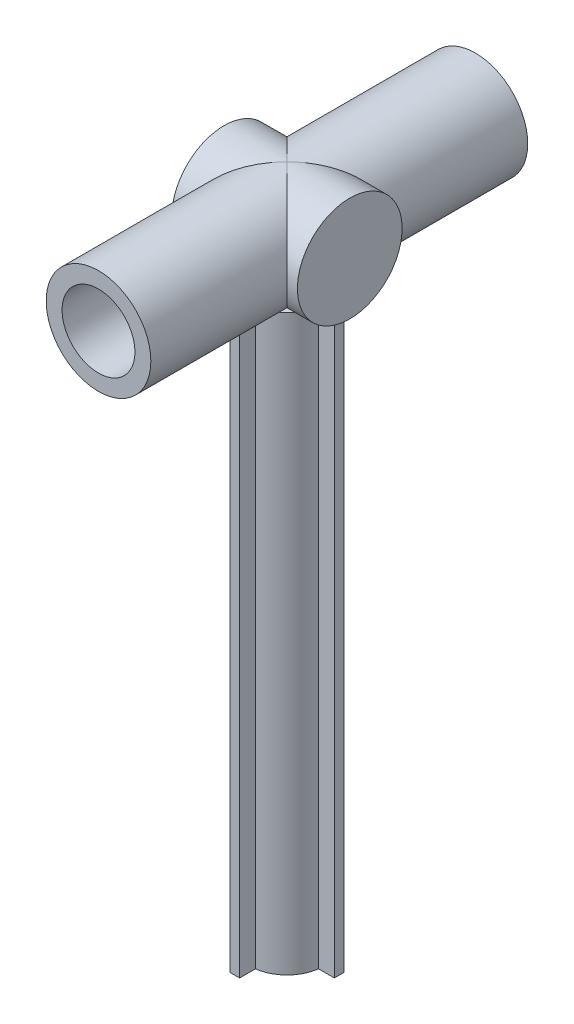
ISO-10303-21;
HEADER;
FILE_DESCRIPTION(('STEP AP214'),'2;1');
FILE_NAME('part.step','',(''),(''),'','','');
FILE_SCHEMA(('AUTOMOTIVE_DESIGN { 1 0 10303 214 1 1 1 1 }'));
ENDSEC;
DATA;
#1=APPLICATION_CONTEXT('core data for automotive mechanical design processes');
#2=APPLICATION_PROTOCOL_DEFINITION('international standard','automotive_design',2000,#1);
#3=PRODUCT_CONTEXT('',#1,'mechanical');
#4=PRODUCT('Part','Part','',(#3));
#5=PRODUCT_RELATED_PRODUCT_CATEGORY('part','',(#4));
#6=PRODUCT_DEFINITION_FORMATION('','',#4);
#7=PRODUCT_DEFINITION_CONTEXT('part definition',#1,'design');
#8=PRODUCT_DEFINITION('design','',#6,#7);
#9=PRODUCT_DEFINITION_SHAPE('','',#8);
#10=(LENGTH_UNIT() NAMED_UNIT(*) SI_UNIT(.MILLI.,.METRE.));
#11=(NAMED_UNIT(*) PLANE_ANGLE_UNIT() SI_UNIT($,.RADIAN.));
#12=(NAMED_UNIT(*) SI_UNIT($,.STERADIAN.) SOLID_ANGLE_UNIT());
#13=UNCERTAINTY_MEASURE_WITH_UNIT(LENGTH_MEASURE(1.E-05),#10,'distance_accuracy_value','');
#14=(GEOMETRIC_REPRESENTATION_CONTEXT(3) GLOBAL_UNCERTAINTY_ASSIGNED_CONTEXT((#13)) GLOBAL_UNIT_ASSIGNED_CONTEXT((#10,
#11,#12)) REPRESENTATION_CONTEXT('',''));
#15=CARTESIAN_POINT('',(0.,0.,0.));
#16=DIRECTION('',(0.,0.,1.));
#17=DIRECTION('',(1.,0.,0.));
#18=AXIS2_PLACEMENT_3D('',#15,#16,#17);
#19=CARTESIAN_POINT('',(0.,75.946,-22.86));
#20=DIRECTION('',(0.,0.,1.));
#21=DIRECTION('',(1.,0.,0.));
#22=AXIS2_PLACEMENT_3D('',#19,#20,#21);
#23=CYLINDRICAL_SURFACE('',#22,6.35);
#24=CARTESIAN_POINT('',(0.,75.946,0.));
#25=DIRECTION('',(0.707106781186547,0.,0.707106781186548));
#26=DIRECTION('',(-0.707106781186547,0.,0.707106781186548));
#27=AXIS2_PLACEMENT_3D('',#24,#25,#26);
#28=ELLIPSE('',#27,8.98025612106915,6.35);
#29=CARTESIAN_POINT('',(0.,69.596,0.));
#30=VERTEX_POINT('',#29);
#31=CARTESIAN_POINT('',(0.,82.296,0.));
#32=VERTEX_POINT('',#31);
#33=EDGE_CURVE('E12',#30,#32,#28,.F.);
#34=ORIENTED_EDGE('',*,*,#33,.F.);
#35=CARTESIAN_POINT('',(0.,75.946,0.));
#36=DIRECTION('',(-0.707106781186547,0.,0.707106781186548));
#37=DIRECTION('',(0.707106781186547,0.,0.707106781186548));
#38=AXIS2_PLACEMENT_3D('',#35,#36,#37);
#39=ELLIPSE('',#38,8.98025612106915,6.35);
#40=EDGE_CURVE('E63',#32,#30,#39,.F.);
#41=ORIENTED_EDGE('',*,*,#40,.F.);
#42=EDGE_LOOP('',(#34,#41));
#43=FACE_BOUND('',#42,.T.);
#44=CARTESIAN_POINT('',(0.,75.946,22.86));
#45=DIRECTION('',(0.,0.,1.));
#46=DIRECTION('',(1.,0.,0.));
#47=AXIS2_PLACEMENT_3D('',#44,#45,#46);
#48=CIRCLE('',#47,6.35);
#49=CARTESIAN_POINT('',(6.35,75.946,22.86));
#50=VERTEX_POINT('',#49);
#51=EDGE_CURVE('E87',#50,#50,#48,.T.);
#52=ORIENTED_EDGE('',*,*,#51,.F.);
#53=EDGE_LOOP('',(#52));
#54=FACE_BOUND('',#53,.T.);
#55=ADVANCED_FACE('F49',(#43,#54),#23,.T.);
#56=CARTESIAN_POINT('',(0.,75.946,22.86));
#57=DIRECTION('',(0.,0.,1.));
#58=DIRECTION('',(1.,0.,0.));
#59=AXIS2_PLACEMENT_3D('',#56,#57,#58);
#60=PLANE('',#59);
#61=CARTESIAN_POINT('',(0.,75.946,22.86));
#62=DIRECTION('',(0.,0.,1.));
#63=DIRECTION('',(1.,0.,0.));
#64=AXIS2_PLACEMENT_3D('',#61,#62,#63);
#65=CIRCLE('',#64,4.4194855118974);
#66=CARTESIAN_POINT('',(4.4194855118974,75.946,22.86));
#67=VERTEX_POINT('',#66);
#68=EDGE_CURVE('E145',#67,#67,#65,.T.);
#69=ORIENTED_EDGE('',*,*,#68,.F.);
#70=EDGE_LOOP('',(#69));
#71=FACE_BOUND('',#70,.T.);
#72=ORIENTED_EDGE('',*,*,#51,.T.);
#73=EDGE_LOOP('',(#72));
#74=FACE_BOUND('',#73,.T.);
#75=ADVANCED_FACE('F112',(#71,#74),#60,.T.);
#76=CARTESIAN_POINT('',(7.62,75.946,0.));
#77=DIRECTION('',(1.,0.,0.));
#78=DIRECTION('',(0.,0.,-1.));
#79=AXIS2_PLACEMENT_3D('',#76,#77,#78);
#80=PLANE('',#79);
#81=CARTESIAN_POINT('',(7.62,75.946,0.));
#82=DIRECTION('',(1.,0.,0.));
#83=DIRECTION('',(0.,0.,-1.));
#84=AXIS2_PLACEMENT_3D('',#81,#82,#83);
#85=CIRCLE('',#84,6.35);
#86=CARTESIAN_POINT('',(7.62,75.946,-6.35));
#87=VERTEX_POINT('',#86);
#88=EDGE_CURVE('E88',#87,#87,#85,.T.);
#89=ORIENTED_EDGE('',*,*,#88,.T.);
#90=EDGE_LOOP('',(#89));
#91=FACE_BOUND('',#90,.T.);
#92=ADVANCED_FACE('F116',(#91),#80,.T.);
#93=CARTESIAN_POINT('',(-7.62,75.946,0.));
#94=DIRECTION('',(1.,0.,0.));
#95=DIRECTION('',(0.,0.,-1.));
#96=AXIS2_PLACEMENT_3D('',#93,#94,#95);
#97=CYLINDRICAL_SURFACE('',#96,6.35);
#98=ORIENTED_EDGE('',*,*,#88,.F.);
#99=EDGE_LOOP('',(#98));
#100=FACE_BOUND('',#99,.T.);
#101=ORIENTED_EDGE('',*,*,#40,.T.);
#102=CARTESIAN_POINT('',(0.,75.946,0.));
#103=DIRECTION('',(0.707106781186547,0.,0.707106781186548));
#104=DIRECTION('',(-0.707106781186547,0.,0.707106781186548));
#105=AXIS2_PLACEMENT_3D('',#102,#103,#104);
#106=ELLIPSE('',#105,8.98025612106915,6.35);
#107=EDGE_CURVE('E57',#30,#32,#106,.T.);
#108=ORIENTED_EDGE('',*,*,#107,.T.);
#109=EDGE_LOOP('',(#101,#108));
#110=FACE_BOUND('',#109,.T.);
#111=ADVANCED_FACE('F77',(#100,#110),#97,.T.);
#112=CARTESIAN_POINT('',(0.,75.946,0.));
#113=DIRECTION('',(-0.707106781186547,0.,0.707106781186548));
#114=DIRECTION('',(0.707106781186547,0.,0.707106781186548));
#115=AXIS2_PLACEMENT_3D('',#112,#113,#114);
#116=ELLIPSE('',#115,8.98025612106915,6.35);
#117=EDGE_CURVE('E69',#32,#30,#116,.T.);
#118=ORIENTED_EDGE('',*,*,#117,.T.);
#119=ORIENTED_EDGE('',*,*,#33,.T.);
#120=EDGE_LOOP('',(#118,#119));
#121=FACE_BOUND('',#120,.T.);
#122=CARTESIAN_POINT('',(-7.62,75.946,0.));
#123=DIRECTION('',(1.,0.,0.));
#124=DIRECTION('',(0.,0.,-1.));
#125=AXIS2_PLACEMENT_3D('',#122,#123,#124);
#126=CIRCLE('',#125,6.35);
#127=CARTESIAN_POINT('',(-7.62,75.946,-6.35));
#128=VERTEX_POINT('',#127);
#129=EDGE_CURVE('E85',#128,#128,#126,.T.);
#130=ORIENTED_EDGE('',*,*,#129,.T.);
#131=EDGE_LOOP('',(#130));
#132=FACE_BOUND('',#131,.T.);
#133=ADVANCED_FACE('F78',(#121,#132),#97,.T.);
#134=CARTESIAN_POINT('',(-7.62,75.946,0.));
#135=DIRECTION('',(1.,0.,0.));
#136=DIRECTION('',(0.,0.,-1.));
#137=AXIS2_PLACEMENT_3D('',#134,#135,#136);
#138=PLANE('',#137);
#139=ORIENTED_EDGE('',*,*,#129,.F.);
#140=EDGE_LOOP('',(#139));
#141=FACE_BOUND('',#140,.T.);
#142=ADVANCED_FACE('F81',(#141),#138,.F.);
#143=CARTESIAN_POINT('',(0.,75.946,-22.86));
#144=DIRECTION('',(0.,0.,1.));
#145=DIRECTION('',(1.,0.,0.));
#146=AXIS2_PLACEMENT_3D('',#143,#144,#145);
#147=PLANE('',#146);
#148=CARTESIAN_POINT('',(0.,76.0716290163437,-22.86));
#149=DIRECTION('',(0.,0.,-1.));
#150=DIRECTION('',(-1.,0.,0.));
#151=AXIS2_PLACEMENT_3D('',#148,#149,#150);
#152=CIRCLE('',#151,4.419485573);
#153=CARTESIAN_POINT('',(-4.419485573,76.0716290163437,-22.86));
#154=VERTEX_POINT('',#153);
#155=EDGE_CURVE('E146',#154,#154,#152,.T.);
#156=ORIENTED_EDGE('',*,*,#155,.F.);
#157=EDGE_LOOP('',(#156));
#158=FACE_BOUND('',#157,.T.);
#159=CARTESIAN_POINT('',(0.,75.946,-22.86));
#160=DIRECTION('',(0.,0.,1.));
#161=DIRECTION('',(1.,0.,0.));
#162=AXIS2_PLACEMENT_3D('',#159,#160,#161);
#163=CIRCLE('',#162,6.35);
#164=CARTESIAN_POINT('',(6.35,75.946,-22.86));
#165=VERTEX_POINT('',#164);
#166=EDGE_CURVE('E75',#165,#165,#163,.T.);
#167=ORIENTED_EDGE('',*,*,#166,.F.);
#168=EDGE_LOOP('',(#167));
#169=FACE_BOUND('',#168,.T.);
#170=ADVANCED_FACE('F100',(#158,#169),#147,.F.);
#171=ORIENTED_EDGE('',*,*,#107,.F.);
#172=ORIENTED_EDGE('',*,*,#117,.F.);
#173=EDGE_LOOP('',(#171,#172));
#174=FACE_BOUND('',#173,.T.);
#175=ORIENTED_EDGE('',*,*,#166,.T.);
#176=EDGE_LOOP('',(#175));
#177=FACE_BOUND('',#176,.T.);
#178=ADVANCED_FACE('F51',(#174,#177),#23,.T.);
#179=CARTESIAN_POINT('',(0.,75.946,12.7));
#180=DIRECTION('',(0.,0.,1.));
#181=DIRECTION('',(1.,0.,0.));
#182=AXIS2_PLACEMENT_3D('',#179,#180,#181);
#183=CYLINDRICAL_SURFACE('',#182,4.4194855118974);
#184=CARTESIAN_POINT('',(0.,75.946,12.7));
#185=DIRECTION('',(0.,0.,1.));
#186=DIRECTION('',(1.,0.,0.));
#187=AXIS2_PLACEMENT_3D('',#184,#185,#186);
#188=CIRCLE('',#187,4.4194855118974);
#189=CARTESIAN_POINT('',(4.4194855118974,75.946,12.7));
#190=VERTEX_POINT('',#189);
#191=EDGE_CURVE('E93',#190,#190,#188,.T.);
#192=ORIENTED_EDGE('',*,*,#191,.F.);
#193=EDGE_LOOP('',(#192));
#194=FACE_BOUND('',#193,.T.);
#195=ORIENTED_EDGE('',*,*,#68,.T.);
#196=EDGE_LOOP('',(#195));
#197=FACE_BOUND('',#196,.T.);
#198=ADVANCED_FACE('F107',(#194,#197),#183,.F.);
#199=CARTESIAN_POINT('',(0.,75.946,12.7));
#200=DIRECTION('',(0.,0.,1.));
#201=DIRECTION('',(1.,0.,0.));
#202=AXIS2_PLACEMENT_3D('',#199,#200,#201);
#203=PLANE('',#202);
#204=ORIENTED_EDGE('',*,*,#191,.T.);
#205=EDGE_LOOP('',(#204));
#206=FACE_BOUND('',#205,.T.);
#207=ADVANCED_FACE('F128',(#206),#203,.T.);
#208=CARTESIAN_POINT('',(0.,76.0716290163437,-12.7));
#209=DIRECTION('',(0.,0.,-1.));
#210=DIRECTION('',(-1.,0.,0.));
#211=AXIS2_PLACEMENT_3D('',#208,#209,#210);
#212=CYLINDRICAL_SURFACE('',#211,4.419485573);
#213=CARTESIAN_POINT('',(0.,76.0716290163437,-12.7));
#214=DIRECTION('',(0.,0.,-1.));
#215=DIRECTION('',(-1.,0.,0.));
#216=AXIS2_PLACEMENT_3D('',#213,#214,#215);
#217=CIRCLE('',#216,4.419485573);
#218=CARTESIAN_POINT('',(-4.419485573,76.0716290163437,-12.7));
#219=VERTEX_POINT('',#218);
#220=EDGE_CURVE('E144',#219,#219,#217,.T.);
#221=ORIENTED_EDGE('',*,*,#220,.F.);
#222=EDGE_LOOP('',(#221));
#223=FACE_BOUND('',#222,.T.);
#224=ORIENTED_EDGE('',*,*,#155,.T.);
#225=EDGE_LOOP('',(#224));
#226=FACE_BOUND('',#225,.T.);
#227=ADVANCED_FACE('F132',(#223,#226),#212,.F.);
#228=CARTESIAN_POINT('',(0.,76.0716290163437,-12.7));
#229=DIRECTION('',(0.,0.,-1.));
#230=DIRECTION('',(-1.,0.,0.));
#231=AXIS2_PLACEMENT_3D('',#228,#229,#230);
#232=PLANE('',#231);
#233=ORIENTED_EDGE('',*,*,#220,.T.);
#234=EDGE_LOOP('',(#233));
#235=FACE_BOUND('',#234,.T.);
#236=ADVANCED_FACE('F136',(#235),#232,.T.);
#237=CLOSED_SHELL('',(#55,#75,#92,#111,#133,#142,#170,#178,#198,#207,#227,#236));
#238=MANIFOLD_SOLID_BREP('B2',#237);
#239=CARTESIAN_POINT('',(0.,69.596,0.));
#240=DIRECTION('',(0.,-1.,0.));
#241=DIRECTION('',(0.,0.,-1.));
#242=AXIS2_PLACEMENT_3D('',#239,#240,#241);
#243=CYLINDRICAL_SURFACE('',#242,4.4449999999999);
#244=CARTESIAN_POINT('',(0.,0.,0.));
#245=DIRECTION('',(0.,1.,0.));
#246=DIRECTION('',(0.,0.,-1.));
#247=AXIS2_PLACEMENT_3D('',#244,#245,#246);
#248=CIRCLE('',#247,4.4449999999999);
#249=CARTESIAN_POINT('',(4.40697240880646,0.,-0.580188924418714));
#250=VERTEX_POINT('',#249);
#251=CARTESIAN_POINT('',(0.580188924418771,0.,-4.40697240880635));
#252=VERTEX_POINT('',#251);
#253=EDGE_CURVE('E374',#250,#252,#248,.T.);
#254=ORIENTED_EDGE('',*,*,#253,.T.);
#255=DIRECTION('',(0.,-1.,0.));
#256=VECTOR('',#255,1.);
#257=CARTESIAN_POINT('',(0.580188924418771,69.596,-4.40697240880635));
#258=LINE('',#257,#256);
#259=CARTESIAN_POINT('',(0.580188924418771,69.596,-4.40697240880635));
#260=VERTEX_POINT('',#259);
#261=EDGE_CURVE('E47',#260,#252,#258,.T.);
#262=ORIENTED_EDGE('',*,*,#261,.F.);
#263=CARTESIAN_POINT('',(0.,69.596,0.));
#264=DIRECTION('',(0.,1.,0.));
#265=DIRECTION('',(0.,0.,-1.));
#266=AXIS2_PLACEMENT_3D('',#263,#264,#265);
#267=CIRCLE('',#266,4.4449999999999);
#268=CARTESIAN_POINT('',(4.40697240880646,69.596,-0.580188924418714));
#269=VERTEX_POINT('',#268);
#270=EDGE_CURVE('E405',#269,#260,#267,.T.);
#271=ORIENTED_EDGE('',*,*,#270,.F.);
#272=DIRECTION('',(0.,-1.,0.));
#273=VECTOR('',#272,1.);
#274=CARTESIAN_POINT('',(4.40697240880646,69.596,-0.580188924418714));
#275=LINE('',#274,#273);
#276=EDGE_CURVE('E370',#269,#250,#275,.T.);
#277=ORIENTED_EDGE('',*,*,#276,.T.);
#278=EDGE_LOOP('',(#254,#262,#271,#277));
#279=FACE_BOUND('',#278,.T.);
#280=ADVANCED_FACE('F230',(#279),#243,.T.);
#281=CARTESIAN_POINT('',(0.580188924418771,69.596,-4.40697240880635));
#282=DIRECTION('',(-1.,0.,0.));
#283=DIRECTION('',(0.,0.,1.));
#284=AXIS2_PLACEMENT_3D('',#281,#282,#283);
#285=PLANE('',#284);
#286=DIRECTION('',(0.,0.,-1.));
#287=VECTOR('',#286,1.);
#288=CARTESIAN_POINT('',(0.580188924418771,0.,-4.40697240880635));
#289=LINE('',#288,#287);
#290=CARTESIAN_POINT('',(0.580188924418771,0.,-6.32343900199724));
#291=VERTEX_POINT('',#290);
#292=EDGE_CURVE('E377',#252,#291,#289,.T.);
#293=ORIENTED_EDGE('',*,*,#292,.T.);
#294=DIRECTION('',(0.,-1.,0.));
#295=VECTOR('',#294,1.);
#296=CARTESIAN_POINT('',(0.580188924418771,69.596,-6.32343900199724));
#297=LINE('',#296,#295);
#298=CARTESIAN_POINT('',(0.580188924418771,69.596,-6.32343900199724));
#299=VERTEX_POINT('',#298);
#300=EDGE_CURVE('E238',#299,#291,#297,.T.);
#301=ORIENTED_EDGE('',*,*,#300,.F.);
#302=DIRECTION('',(0.,0.,-1.));
#303=VECTOR('',#302,1.);
#304=CARTESIAN_POINT('',(0.580188924418771,69.596,-4.40697240880635));
#305=LINE('',#304,#303);
#306=EDGE_CURVE('E313',#260,#299,#305,.T.);
#307=ORIENTED_EDGE('',*,*,#306,.F.);
#308=ORIENTED_EDGE('',*,*,#261,.T.);
#309=EDGE_LOOP('',(#293,#301,#307,#308));
#310=FACE_BOUND('',#309,.T.);
#311=ADVANCED_FACE('F504',(#310),#285,.F.);
#312=CARTESIAN_POINT('',(0.580188924418771,69.596,-6.32343900199724));
#313=DIRECTION('',(0.,0.,1.));
#314=DIRECTION('',(1.,0.,0.));
#315=AXIS2_PLACEMENT_3D('',#312,#313,#314);
#316=PLANE('',#315);
#317=DIRECTION('',(-1.,0.,0.));
#318=VECTOR('',#317,1.);
#319=CARTESIAN_POINT('',(0.580188924418771,0.,-6.32343900199724));
#320=LINE('',#319,#318);
#321=CARTESIAN_POINT('',(-0.580188924418782,0.,-6.32343900199724));
#322=VERTEX_POINT('',#321);
#323=EDGE_CURVE('E380',#291,#322,#320,.T.);
#324=ORIENTED_EDGE('',*,*,#323,.T.);
#325=DIRECTION('',(0.,-1.,0.));
#326=VECTOR('',#325,1.);
#327=CARTESIAN_POINT('',(-0.580188924418782,69.596,-6.32343900199724));
#328=LINE('',#327,#326);
#329=CARTESIAN_POINT('',(-0.580188924418782,69.596,-6.32343900199724));
#330=VERTEX_POINT('',#329);
#331=EDGE_CURVE('E436',#330,#322,#328,.T.);
#332=ORIENTED_EDGE('',*,*,#331,.F.);
#333=DIRECTION('',(-1.,0.,0.));
#334=VECTOR('',#333,1.);
#335=CARTESIAN_POINT('',(0.580188924418771,69.596,-6.32343900199724));
#336=LINE('',#335,#334);
#337=EDGE_CURVE('E444',#299,#330,#336,.T.);
#338=ORIENTED_EDGE('',*,*,#337,.F.);
#339=ORIENTED_EDGE('',*,*,#300,.T.);
#340=EDGE_LOOP('',(#324,#332,#338,#339));
#341=FACE_BOUND('',#340,.T.);
#342=ADVANCED_FACE('F442',(#341),#316,.F.);
#343=CARTESIAN_POINT('',(-0.580188924418782,69.596,-4.4069724088065));
#344=DIRECTION('',(1.,0.,0.));
#345=DIRECTION('',(0.,0.,-1.));
#346=AXIS2_PLACEMENT_3D('',#343,#344,#345);
#347=PLANE('',#346);
#348=DIRECTION('',(0.,0.,1.));
#349=VECTOR('',#348,1.);
#350=CARTESIAN_POINT('',(-0.580188924418782,0.,-4.4069724088065));
#351=LINE('',#350,#349);
#352=CARTESIAN_POINT('',(-0.580188924418782,0.,-4.4069724088065));
#353=VERTEX_POINT('',#352);
#354=EDGE_CURVE('E382',#322,#353,#351,.T.);
#355=ORIENTED_EDGE('',*,*,#354,.T.);
#356=DIRECTION('',(0.,-1.,0.));
#357=VECTOR('',#356,1.);
#358=CARTESIAN_POINT('',(-0.580188924418782,69.596,-4.4069724088065));
#359=LINE('',#358,#357);
#360=CARTESIAN_POINT('',(-0.580188924418782,69.596,-4.4069724088065));
#361=VERTEX_POINT('',#360);
#362=EDGE_CURVE('E433',#361,#353,#359,.T.);
#363=ORIENTED_EDGE('',*,*,#362,.F.);
#364=DIRECTION('',(0.,0.,1.));
#365=VECTOR('',#364,1.);
#366=CARTESIAN_POINT('',(-0.580188924418782,69.596,-4.4069724088065));
#367=LINE('',#366,#365);
#368=EDGE_CURVE('E462',#330,#361,#367,.T.);
#369=ORIENTED_EDGE('',*,*,#368,.F.);
#370=ORIENTED_EDGE('',*,*,#331,.T.);
#371=EDGE_LOOP('',(#355,#363,#369,#370));
#372=FACE_BOUND('',#371,.T.);
#373=ADVANCED_FACE('F453',(#372),#347,.F.);
#374=CARTESIAN_POINT('',(0.,69.596,0.));
#375=DIRECTION('',(0.,-1.,0.));
#376=DIRECTION('',(0.,0.,-1.));
#377=AXIS2_PLACEMENT_3D('',#374,#375,#376);
#378=CYLINDRICAL_SURFACE('',#377,4.44500000000004);
#379=CARTESIAN_POINT('',(0.,0.,0.));
#380=DIRECTION('',(0.,1.,0.));
#381=DIRECTION('',(0.,0.,1.));
#382=AXIS2_PLACEMENT_3D('',#379,#380,#381);
#383=CIRCLE('',#382,4.44500000000004);
#384=CARTESIAN_POINT('',(-4.40697240880651,0.,-0.580188924418716));
#385=VERTEX_POINT('',#384);
#386=EDGE_CURVE('E384',#353,#385,#383,.T.);
#387=ORIENTED_EDGE('',*,*,#386,.T.);
#388=DIRECTION('',(0.,-1.,0.));
#389=VECTOR('',#388,1.);
#390=CARTESIAN_POINT('',(-4.40697240880651,69.596,-0.580188924418716));
#391=LINE('',#390,#389);
#392=CARTESIAN_POINT('',(-4.40697240880651,69.596,-0.580188924418716));
#393=VERTEX_POINT('',#392);
#394=EDGE_CURVE('E430',#393,#385,#391,.T.);
#395=ORIENTED_EDGE('',*,*,#394,.F.);
#396=CARTESIAN_POINT('',(0.,69.596,0.));
#397=DIRECTION('',(0.,1.,0.));
#398=DIRECTION('',(0.,0.,1.));
#399=AXIS2_PLACEMENT_3D('',#396,#397,#398);
#400=CIRCLE('',#399,4.44500000000004);
#401=EDGE_CURVE('E459',#361,#393,#400,.T.);
#402=ORIENTED_EDGE('',*,*,#401,.F.);
#403=ORIENTED_EDGE('',*,*,#362,.T.);
#404=EDGE_LOOP('',(#387,#395,#402,#403));
#405=FACE_BOUND('',#404,.T.);
#406=ADVANCED_FACE('F457',(#405),#378,.T.);
#407=CARTESIAN_POINT('',(-4.40697240880651,69.596,-0.580188924418714));
#408=DIRECTION('',(0.,0.,1.));
#409=DIRECTION('',(1.,0.,0.));
#410=AXIS2_PLACEMENT_3D('',#407,#408,#409);
#411=PLANE('',#410);
#412=DIRECTION('',(-1.,0.,0.));
#413=VECTOR('',#412,1.);
#414=CARTESIAN_POINT('',(-4.40697240880651,0.,-0.580188924418714));
#415=LINE('',#414,#413);
#416=CARTESIAN_POINT('',(-6.3234390019974,0.,-0.580188924418716));
#417=VERTEX_POINT('',#416);
#418=EDGE_CURVE('E386',#385,#417,#415,.T.);
#419=ORIENTED_EDGE('',*,*,#418,.T.);
#420=DIRECTION('',(0.,-1.,0.));
#421=VECTOR('',#420,1.);
#422=CARTESIAN_POINT('',(-6.3234390019974,69.596,-0.580188924418716));
#423=LINE('',#422,#421);
#424=CARTESIAN_POINT('',(-6.3234390019974,69.596,-0.580188924418716));
#425=VERTEX_POINT('',#424);
#426=EDGE_CURVE('E427',#425,#417,#423,.T.);
#427=ORIENTED_EDGE('',*,*,#426,.F.);
#428=DIRECTION('',(-1.,0.,0.));
#429=VECTOR('',#428,1.);
#430=CARTESIAN_POINT('',(-4.40697240880651,69.596,-0.580188924418714));
#431=LINE('',#430,#429);
#432=EDGE_CURVE('E461',#393,#425,#431,.T.);
#433=ORIENTED_EDGE('',*,*,#432,.F.);
#434=ORIENTED_EDGE('',*,*,#394,.T.);
#435=EDGE_LOOP('',(#419,#427,#433,#434));
#436=FACE_BOUND('',#435,.T.);
#437=ADVANCED_FACE('F517',(#436),#411,.F.);
#438=CARTESIAN_POINT('',(-6.3234390019974,69.596,0.580188924418717));
#439=DIRECTION('',(1.,0.,0.));
#440=DIRECTION('',(0.,0.,-1.));
#441=AXIS2_PLACEMENT_3D('',#438,#439,#440);
#442=PLANE('',#441);
#443=DIRECTION('',(0.,0.,1.));
#444=VECTOR('',#443,1.);
#445=CARTESIAN_POINT('',(-6.3234390019974,0.,0.580188924418717));
#446=LINE('',#445,#444);
#447=CARTESIAN_POINT('',(-6.3234390019974,0.,0.580188924418717));
#448=VERTEX_POINT('',#447);
#449=EDGE_CURVE('E388',#417,#448,#446,.T.);
#450=ORIENTED_EDGE('',*,*,#449,.T.);
#451=DIRECTION('',(0.,-1.,0.));
#452=VECTOR('',#451,1.);
#453=CARTESIAN_POINT('',(-6.3234390019974,69.596,0.580188924418717));
#454=LINE('',#453,#452);
#455=CARTESIAN_POINT('',(-6.3234390019974,69.596,0.580188924418717));
#456=VERTEX_POINT('',#455);
#457=EDGE_CURVE('E424',#456,#448,#454,.T.);
#458=ORIENTED_EDGE('',*,*,#457,.F.);
#459=DIRECTION('',(0.,0.,1.));
#460=VECTOR('',#459,1.);
#461=CARTESIAN_POINT('',(-6.3234390019974,69.596,0.580188924418717));
#462=LINE('',#461,#460);
#463=EDGE_CURVE('E464',#425,#456,#462,.T.);
#464=ORIENTED_EDGE('',*,*,#463,.F.);
#465=ORIENTED_EDGE('',*,*,#426,.T.);
#466=EDGE_LOOP('',(#450,#458,#464,#465));
#467=FACE_BOUND('',#466,.T.);
#468=ADVANCED_FACE('F520',(#467),#442,.F.);
#469=CARTESIAN_POINT('',(-4.40697240880651,69.596,0.580188924418718));
#470=DIRECTION('',(0.,0.,-1.));
#471=DIRECTION('',(-1.,0.,0.));
#472=AXIS2_PLACEMENT_3D('',#469,#470,#471);
#473=PLANE('',#472);
#474=DIRECTION('',(1.,0.,0.));
#475=VECTOR('',#474,1.);
#476=CARTESIAN_POINT('',(-4.40697240880651,0.,0.580188924418718));
#477=LINE('',#476,#475);
#478=CARTESIAN_POINT('',(-4.40697240880651,0.,0.580188924418718));
#479=VERTEX_POINT('',#478);
#480=EDGE_CURVE('E390',#448,#479,#477,.T.);
#481=ORIENTED_EDGE('',*,*,#480,.T.);
#482=DIRECTION('',(0.,-1.,0.));
#483=VECTOR('',#482,1.);
#484=CARTESIAN_POINT('',(-4.40697240880651,69.596,0.580188924418718));
#485=LINE('',#484,#483);
#486=CARTESIAN_POINT('',(-4.40697240880651,69.596,0.580188924418718));
#487=VERTEX_POINT('',#486);
#488=EDGE_CURVE('E421',#487,#479,#485,.T.);
#489=ORIENTED_EDGE('',*,*,#488,.F.);
#490=DIRECTION('',(1.,0.,0.));
#491=VECTOR('',#490,1.);
#492=CARTESIAN_POINT('',(-4.40697240880651,69.596,0.580188924418718));
#493=LINE('',#492,#491);
#494=EDGE_CURVE('E470',#456,#487,#493,.T.);
#495=ORIENTED_EDGE('',*,*,#494,.F.);
#496=ORIENTED_EDGE('',*,*,#457,.T.);
#497=EDGE_LOOP('',(#481,#489,#495,#496));
#498=FACE_BOUND('',#497,.T.);
#499=ADVANCED_FACE('F524',(#498),#473,.F.);
#500=CARTESIAN_POINT('',(0.,69.596,0.));
#501=DIRECTION('',(0.,-1.,0.));
#502=DIRECTION('',(0.,0.,-1.));
#503=AXIS2_PLACEMENT_3D('',#500,#501,#502);
#504=CYLINDRICAL_SURFACE('',#503,4.445);
#505=CARTESIAN_POINT('',(0.,0.,0.));
#506=DIRECTION('',(0.,1.,0.));
#507=DIRECTION('',(0.,0.,-1.));
#508=AXIS2_PLACEMENT_3D('',#505,#506,#507);
#509=CIRCLE('',#508,4.445);
#510=CARTESIAN_POINT('',(-0.580188924418782,0.,4.4069724088065));
#511=VERTEX_POINT('',#510);
#512=EDGE_CURVE('E392',#479,#511,#509,.T.);
#513=ORIENTED_EDGE('',*,*,#512,.T.);
#514=DIRECTION('',(0.,-1.,0.));
#515=VECTOR('',#514,1.);
#516=CARTESIAN_POINT('',(-0.580188924418782,69.596,4.4069724088065));
#517=LINE('',#516,#515);
#518=CARTESIAN_POINT('',(-0.580188924418782,69.596,4.4069724088065));
#519=VERTEX_POINT('',#518);
#520=EDGE_CURVE('E418',#519,#511,#517,.T.);
#521=ORIENTED_EDGE('',*,*,#520,.F.);
#522=CARTESIAN_POINT('',(0.,69.596,0.));
#523=DIRECTION('',(0.,1.,0.));
#524=DIRECTION('',(0.,0.,-1.));
#525=AXIS2_PLACEMENT_3D('',#522,#523,#524);
#526=CIRCLE('',#525,4.445);
#527=EDGE_CURVE('E472',#487,#519,#526,.T.);
#528=ORIENTED_EDGE('',*,*,#527,.F.);
#529=ORIENTED_EDGE('',*,*,#488,.T.);
#530=EDGE_LOOP('',(#513,#521,#528,#529));
#531=FACE_BOUND('',#530,.T.);
#532=ADVANCED_FACE('F528',(#531),#504,.T.);
#533=CARTESIAN_POINT('',(-0.580188924418782,69.596,4.4069724088065));
#534=DIRECTION('',(1.,0.,0.));
#535=DIRECTION('',(0.,0.,-1.));
#536=AXIS2_PLACEMENT_3D('',#533,#534,#535);
#537=PLANE('',#536);
#538=DIRECTION('',(0.,0.,1.));
#539=VECTOR('',#538,1.);
#540=CARTESIAN_POINT('',(-0.580188924418782,0.,4.4069724088065));
#541=LINE('',#540,#539);
#542=CARTESIAN_POINT('',(-0.580188924418782,0.,6.32343900199724));
#543=VERTEX_POINT('',#542);
#544=EDGE_CURVE('E394',#511,#543,#541,.T.);
#545=ORIENTED_EDGE('',*,*,#544,.T.);
#546=DIRECTION('',(0.,-1.,0.));
#547=VECTOR('',#546,1.);
#548=CARTESIAN_POINT('',(-0.580188924418782,69.596,6.32343900199724));
#549=LINE('',#548,#547);
#550=CARTESIAN_POINT('',(-0.580188924418782,69.596,6.32343900199724));
#551=VERTEX_POINT('',#550);
#552=EDGE_CURVE('E415',#551,#543,#549,.T.);
#553=ORIENTED_EDGE('',*,*,#552,.F.);
#554=DIRECTION('',(0.,0.,1.));
#555=VECTOR('',#554,1.);
#556=CARTESIAN_POINT('',(-0.580188924418782,69.596,4.4069724088065));
#557=LINE('',#556,#555);
#558=EDGE_CURVE('E474',#519,#551,#557,.T.);
#559=ORIENTED_EDGE('',*,*,#558,.F.);
#560=ORIENTED_EDGE('',*,*,#520,.T.);
#561=EDGE_LOOP('',(#545,#553,#559,#560));
#562=FACE_BOUND('',#561,.T.);
#563=ADVANCED_FACE('F532',(#562),#537,.F.);
#564=CARTESIAN_POINT('',(0.580188924418651,69.596,6.32343900199724));
#565=DIRECTION('',(0.,0.,-1.));
#566=DIRECTION('',(-1.,0.,0.));
#567=AXIS2_PLACEMENT_3D('',#564,#565,#566);
#568=PLANE('',#567);
#569=DIRECTION('',(1.,0.,0.));
#570=VECTOR('',#569,1.);
#571=CARTESIAN_POINT('',(0.580188924418651,0.,6.32343900199724));
#572=LINE('',#571,#570);
#573=CARTESIAN_POINT('',(0.580188924418651,0.,6.32343900199724));
#574=VERTEX_POINT('',#573);
#575=EDGE_CURVE('E396',#543,#574,#572,.T.);
#576=ORIENTED_EDGE('',*,*,#575,.T.);
#577=DIRECTION('',(0.,-1.,0.));
#578=VECTOR('',#577,1.);
#579=CARTESIAN_POINT('',(0.580188924418651,69.596,6.32343900199724));
#580=LINE('',#579,#578);
#581=CARTESIAN_POINT('',(0.580188924418651,69.596,6.32343900199724));
#582=VERTEX_POINT('',#581);
#583=EDGE_CURVE('E412',#582,#574,#580,.T.);
#584=ORIENTED_EDGE('',*,*,#583,.F.);
#585=DIRECTION('',(1.,0.,0.));
#586=VECTOR('',#585,1.);
#587=CARTESIAN_POINT('',(0.580188924418651,69.596,6.32343900199724));
#588=LINE('',#587,#586);
#589=EDGE_CURVE('E476',#551,#582,#588,.T.);
#590=ORIENTED_EDGE('',*,*,#589,.F.);
#591=ORIENTED_EDGE('',*,*,#552,.T.);
#592=EDGE_LOOP('',(#576,#584,#590,#591));
#593=FACE_BOUND('',#592,.T.);
#594=ADVANCED_FACE('F536',(#593),#568,.F.);
#595=CARTESIAN_POINT('',(0.580188924418771,69.596,4.40697240880635));
#596=DIRECTION('',(-1.,0.,0.));
#597=DIRECTION('',(0.,0.,1.));
#598=AXIS2_PLACEMENT_3D('',#595,#596,#597);
#599=PLANE('',#598);
#600=DIRECTION('',(0.,0.,-1.));
#601=VECTOR('',#600,1.);
#602=CARTESIAN_POINT('',(0.580188924418771,0.,4.40697240880635));
#603=LINE('',#602,#601);
#604=CARTESIAN_POINT('',(0.580188924418771,0.,4.40697240880635));
#605=VERTEX_POINT('',#604);
#606=EDGE_CURVE('E398',#574,#605,#603,.T.);
#607=ORIENTED_EDGE('',*,*,#606,.T.);
#608=DIRECTION('',(0.,-1.,0.));
#609=VECTOR('',#608,1.);
#610=CARTESIAN_POINT('',(0.580188924418771,69.596,4.40697240880635));
#611=LINE('',#610,#609);
#612=CARTESIAN_POINT('',(0.580188924418771,69.596,4.40697240880635));
#613=VERTEX_POINT('',#612);
#614=EDGE_CURVE('E409',#613,#605,#611,.T.);
#615=ORIENTED_EDGE('',*,*,#614,.F.);
#616=DIRECTION('',(0.,0.,-1.));
#617=VECTOR('',#616,1.);
#618=CARTESIAN_POINT('',(0.580188924418771,69.596,4.40697240880635));
#619=LINE('',#618,#617);
#620=EDGE_CURVE('E478',#582,#613,#619,.T.);
#621=ORIENTED_EDGE('',*,*,#620,.F.);
#622=ORIENTED_EDGE('',*,*,#583,.T.);
#623=EDGE_LOOP('',(#607,#615,#621,#622));
#624=FACE_BOUND('',#623,.T.);
#625=ADVANCED_FACE('F484',(#624),#599,.F.);
#626=CARTESIAN_POINT('',(-2.40259201422788E-13,69.596,-1.17635935714677E-13));
#627=DIRECTION('',(0.,-1.,0.));
#628=DIRECTION('',(0.,0.,-1.));
#629=AXIS2_PLACEMENT_3D('',#626,#627,#628);
#630=CYLINDRICAL_SURFACE('',#629,4.44500000000013);
#631=CARTESIAN_POINT('',(-2.40259201422788E-13,0.,-1.17635935714677E-13));
#632=DIRECTION('',(0.,1.,0.));
#633=DIRECTION('',(0.,0.,-1.));
#634=AXIS2_PLACEMENT_3D('',#631,#632,#633);
#635=CIRCLE('',#634,4.44500000000013);
#636=CARTESIAN_POINT('',(4.40697240880638,0.,0.580188924418702));
#637=VERTEX_POINT('',#636);
#638=EDGE_CURVE('E400',#605,#637,#635,.T.);
#639=ORIENTED_EDGE('',*,*,#638,.T.);
#640=DIRECTION('',(0.,-1.,0.));
#641=VECTOR('',#640,1.);
#642=CARTESIAN_POINT('',(4.40697240880638,69.596,0.580188924418702));
#643=LINE('',#642,#641);
#644=CARTESIAN_POINT('',(4.40697240880638,69.596,0.580188924418702));
#645=VERTEX_POINT('',#644);
#646=EDGE_CURVE('E365',#645,#637,#643,.T.);
#647=ORIENTED_EDGE('',*,*,#646,.F.);
#648=CARTESIAN_POINT('',(-2.40259201422788E-13,69.596,-1.17635935714677E-13));
#649=DIRECTION('',(0.,1.,0.));
#650=DIRECTION('',(0.,0.,-1.));
#651=AXIS2_PLACEMENT_3D('',#648,#649,#650);
#652=CIRCLE('',#651,4.44500000000013);
#653=EDGE_CURVE('E356',#613,#645,#652,.T.);
#654=ORIENTED_EDGE('',*,*,#653,.F.);
#655=ORIENTED_EDGE('',*,*,#614,.T.);
#656=EDGE_LOOP('',(#639,#647,#654,#655));
#657=FACE_BOUND('',#656,.T.);
#658=ADVANCED_FACE('F488',(#657),#630,.T.);
#659=CARTESIAN_POINT('',(4.40697240880651,69.596,0.580188924418718));
#660=DIRECTION('',(0.,0.,-1.));
#661=DIRECTION('',(-1.,0.,0.));
#662=AXIS2_PLACEMENT_3D('',#659,#660,#661);
#663=PLANE('',#662);
#664=DIRECTION('',(1.,0.,0.));
#665=VECTOR('',#664,1.);
#666=CARTESIAN_POINT('',(4.40697240880651,0.,0.580188924418718));
#667=LINE('',#666,#665);
#668=CARTESIAN_POINT('',(6.32343900199715,0.,0.580188924418567));
#669=VERTEX_POINT('',#668);
#670=EDGE_CURVE('E364',#637,#669,#667,.T.);
#671=ORIENTED_EDGE('',*,*,#670,.T.);
#672=DIRECTION('',(0.,-1.,0.));
#673=VECTOR('',#672,1.);
#674=CARTESIAN_POINT('',(6.32343900199715,69.596,0.580188924418567));
#675=LINE('',#674,#673);
#676=CARTESIAN_POINT('',(6.32343900199715,69.596,0.580188924418567));
#677=VERTEX_POINT('',#676);
#678=EDGE_CURVE('E361',#677,#669,#675,.T.);
#679=ORIENTED_EDGE('',*,*,#678,.F.);
#680=DIRECTION('',(1.,0.,0.));
#681=VECTOR('',#680,1.);
#682=CARTESIAN_POINT('',(4.40697240880651,69.596,0.580188924418718));
#683=LINE('',#682,#681);
#684=EDGE_CURVE('E350',#645,#677,#683,.T.);
#685=ORIENTED_EDGE('',*,*,#684,.F.);
#686=ORIENTED_EDGE('',*,*,#646,.T.);
#687=EDGE_LOOP('',(#671,#679,#685,#686));
#688=FACE_BOUND('',#687,.T.);
#689=ADVANCED_FACE('F362',(#688),#663,.F.);
#690=CARTESIAN_POINT('',(6.32343900199715,69.596,0.580188924418567));
#691=DIRECTION('',(-1.,0.,0.));
#692=DIRECTION('',(0.,0.,1.));
#693=AXIS2_PLACEMENT_3D('',#690,#691,#692);
#694=PLANE('',#693);
#695=DIRECTION('',(0.,0.,-1.));
#696=VECTOR('',#695,1.);
#697=CARTESIAN_POINT('',(6.32343900199715,0.,0.580188924418567));
#698=LINE('',#697,#696);
#699=CARTESIAN_POINT('',(6.32343900199715,0.,-0.580188924418866));
#700=VERTEX_POINT('',#699);
#701=EDGE_CURVE('E299',#669,#700,#698,.T.);
#702=ORIENTED_EDGE('',*,*,#701,.T.);
#703=DIRECTION('',(0.,-1.,0.));
#704=VECTOR('',#703,1.);
#705=CARTESIAN_POINT('',(6.32343900199715,69.596,-0.580188924418866));
#706=LINE('',#705,#704);
#707=CARTESIAN_POINT('',(6.32343900199715,69.596,-0.580188924418866));
#708=VERTEX_POINT('',#707);
#709=EDGE_CURVE('E366',#708,#700,#706,.T.);
#710=ORIENTED_EDGE('',*,*,#709,.F.);
#711=DIRECTION('',(0.,0.,-1.));
#712=VECTOR('',#711,1.);
#713=CARTESIAN_POINT('',(6.32343900199715,69.596,0.580188924418567));
#714=LINE('',#713,#712);
#715=EDGE_CURVE('E354',#677,#708,#714,.T.);
#716=ORIENTED_EDGE('',*,*,#715,.F.);
#717=ORIENTED_EDGE('',*,*,#678,.T.);
#718=EDGE_LOOP('',(#702,#710,#716,#717));
#719=FACE_BOUND('',#718,.T.);
#720=ADVANCED_FACE('F368',(#719),#694,.F.);
#721=CARTESIAN_POINT('',(4.40697240880646,69.596,-0.580188924418714));
#722=DIRECTION('',(0.,0.,1.));
#723=DIRECTION('',(1.,0.,0.));
#724=AXIS2_PLACEMENT_3D('',#721,#722,#723);
#725=PLANE('',#724);
#726=DIRECTION('',(-1.,0.,0.));
#727=VECTOR('',#726,1.);
#728=CARTESIAN_POINT('',(4.40697240880646,0.,-0.580188924418714));
#729=LINE('',#728,#727);
#730=EDGE_CURVE('E305',#700,#250,#729,.T.);
#731=ORIENTED_EDGE('',*,*,#730,.T.);
#732=ORIENTED_EDGE('',*,*,#276,.F.);
#733=DIRECTION('',(-1.,0.,0.));
#734=VECTOR('',#733,1.);
#735=CARTESIAN_POINT('',(4.40697240880646,69.596,-0.580188924418714));
#736=LINE('',#735,#734);
#737=EDGE_CURVE('E246',#708,#269,#736,.T.);
#738=ORIENTED_EDGE('',*,*,#737,.F.);
#739=ORIENTED_EDGE('',*,*,#709,.T.);
#740=EDGE_LOOP('',(#731,#732,#738,#739));
#741=FACE_BOUND('',#740,.T.);
#742=ADVANCED_FACE('F492',(#741),#725,.F.);
#743=CARTESIAN_POINT('',(0.,69.596,0.));
#744=DIRECTION('',(0.,-1.,0.));
#745=DIRECTION('',(0.,0.,-1.));
#746=AXIS2_PLACEMENT_3D('',#743,#744,#745);
#747=PLANE('',#746);
#748=CARTESIAN_POINT('',(0.,69.596,0.));
#749=DIRECTION('',(0.,1.,0.));
#750=DIRECTION('',(0.,0.,1.));
#751=AXIS2_PLACEMENT_3D('',#748,#749,#750);
#752=CIRCLE('',#751,2.794);
#753=CARTESIAN_POINT('',(0.,69.596,2.79400000000003));
#754=VERTEX_POINT('',#753);
#755=EDGE_CURVE('E591',#754,#754,#752,.T.);
#756=ORIENTED_EDGE('',*,*,#755,.F.);
#757=EDGE_LOOP('',(#756));
#758=FACE_BOUND('',#757,.T.);
#759=ORIENTED_EDGE('',*,*,#270,.T.);
#760=ORIENTED_EDGE('',*,*,#306,.T.);
#761=ORIENTED_EDGE('',*,*,#337,.T.);
#762=ORIENTED_EDGE('',*,*,#368,.T.);
#763=ORIENTED_EDGE('',*,*,#401,.T.);
#764=ORIENTED_EDGE('',*,*,#432,.T.);
#765=ORIENTED_EDGE('',*,*,#463,.T.);
#766=ORIENTED_EDGE('',*,*,#494,.T.);
#767=ORIENTED_EDGE('',*,*,#527,.T.);
#768=ORIENTED_EDGE('',*,*,#558,.T.);
#769=ORIENTED_EDGE('',*,*,#589,.T.);
#770=ORIENTED_EDGE('',*,*,#620,.T.);
#771=ORIENTED_EDGE('',*,*,#653,.T.);
#772=ORIENTED_EDGE('',*,*,#684,.T.);
#773=ORIENTED_EDGE('',*,*,#715,.T.);
#774=ORIENTED_EDGE('',*,*,#737,.T.);
#775=EDGE_LOOP('',(#759,#760,#761,#762,#763,#764,#765,#766,#767,#768,#769,#770,#771,#772,#773,#774));
#776=FACE_BOUND('',#775,.T.);
#777=ADVANCED_FACE('F352',(#758,#776),#747,.F.);
#778=CARTESIAN_POINT('',(0.,0.,0.));
#779=DIRECTION('',(0.,-1.,0.));
#780=DIRECTION('',(0.,0.,-1.));
#781=AXIS2_PLACEMENT_3D('',#778,#779,#780);
#782=PLANE('',#781);
#783=CARTESIAN_POINT('',(0.,0.,0.));
#784=DIRECTION('',(0.,1.,0.));
#785=DIRECTION('',(0.,0.,1.));
#786=AXIS2_PLACEMENT_3D('',#783,#784,#785);
#787=CIRCLE('',#786,2.794);
#788=CARTESIAN_POINT('',(0.,0.,2.79400000000003));
#789=VERTEX_POINT('',#788);
#790=EDGE_CURVE('E378',#789,#789,#787,.T.);
#791=ORIENTED_EDGE('',*,*,#790,.T.);
#792=EDGE_LOOP('',(#791));
#793=FACE_BOUND('',#792,.T.);
#794=ORIENTED_EDGE('',*,*,#253,.F.);
#795=ORIENTED_EDGE('',*,*,#730,.F.);
#796=ORIENTED_EDGE('',*,*,#701,.F.);
#797=ORIENTED_EDGE('',*,*,#670,.F.);
#798=ORIENTED_EDGE('',*,*,#638,.F.);
#799=ORIENTED_EDGE('',*,*,#606,.F.);
#800=ORIENTED_EDGE('',*,*,#575,.F.);
#801=ORIENTED_EDGE('',*,*,#544,.F.);
#802=ORIENTED_EDGE('',*,*,#512,.F.);
#803=ORIENTED_EDGE('',*,*,#480,.F.);
#804=ORIENTED_EDGE('',*,*,#449,.F.);
#805=ORIENTED_EDGE('',*,*,#418,.F.);
#806=ORIENTED_EDGE('',*,*,#386,.F.);
#807=ORIENTED_EDGE('',*,*,#354,.F.);
#808=ORIENTED_EDGE('',*,*,#323,.F.);
#809=ORIENTED_EDGE('',*,*,#292,.F.);
#810=EDGE_LOOP('',(#794,#795,#796,#797,#798,#799,#800,#801,#802,#803,#804,#805,#806,#807,#808,#809));
#811=FACE_BOUND('',#810,.T.);
#812=ADVANCED_FACE('F448',(#793,#811),#782,.T.);
#813=CARTESIAN_POINT('',(0.,0.,0.));
#814=DIRECTION('',(0.,1.,0.));
#815=DIRECTION('',(0.,0.,1.));
#816=AXIS2_PLACEMENT_3D('',#813,#814,#815);
#817=CYLINDRICAL_SURFACE('',#816,2.794);
#818=ORIENTED_EDGE('',*,*,#790,.F.);
#819=EDGE_LOOP('',(#818));
#820=FACE_BOUND('',#819,.T.);
#821=ORIENTED_EDGE('',*,*,#755,.T.);
#822=EDGE_LOOP('',(#821));
#823=FACE_BOUND('',#822,.T.);
#824=ADVANCED_FACE('F573',(#820,#823),#817,.F.);
#825=CLOSED_SHELL('',(#280,#311,#342,#373,#406,#437,#468,#499,#532,#563,#594,#625,#658,#689,
#720,#742,#777,#812,#824));
#826=MANIFOLD_SOLID_BREP('B6',#825);
#827=ADVANCED_BREP_SHAPE_REPRESENTATION('',(#18,#238,#826),#14);
#828=SHAPE_DEFINITION_REPRESENTATION(#9,#827);
ENDSEC;
END-ISO-10303-21;
